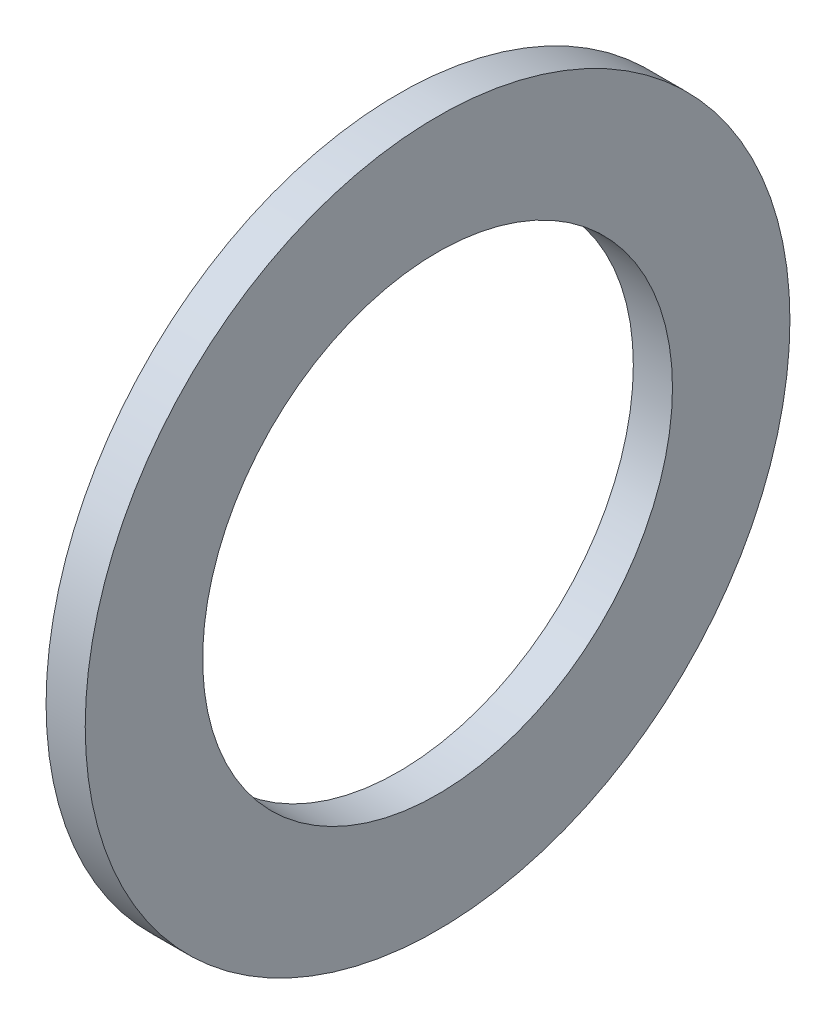
ISO-10303-21;
HEADER;
FILE_DESCRIPTION(('STEP AP214'),'2;1');
FILE_NAME('part.step','',(''),(''),'','','');
FILE_SCHEMA(('AUTOMOTIVE_DESIGN { 1 0 10303 214 1 1 1 1 }'));
ENDSEC;
DATA;
#1=APPLICATION_CONTEXT('core data for automotive mechanical design processes');
#2=APPLICATION_PROTOCOL_DEFINITION('international standard','automotive_design',2000,#1);
#3=PRODUCT_CONTEXT('',#1,'mechanical');
#4=PRODUCT('Part','Part','',(#3));
#5=PRODUCT_RELATED_PRODUCT_CATEGORY('part','',(#4));
#6=PRODUCT_DEFINITION_FORMATION('','',#4);
#7=PRODUCT_DEFINITION_CONTEXT('part definition',#1,'design');
#8=PRODUCT_DEFINITION('design','',#6,#7);
#9=PRODUCT_DEFINITION_SHAPE('','',#8);
#10=(LENGTH_UNIT() NAMED_UNIT(*) SI_UNIT(.MILLI.,.METRE.));
#11=(NAMED_UNIT(*) PLANE_ANGLE_UNIT() SI_UNIT($,.RADIAN.));
#12=(NAMED_UNIT(*) SI_UNIT($,.STERADIAN.) SOLID_ANGLE_UNIT());
#13=UNCERTAINTY_MEASURE_WITH_UNIT(LENGTH_MEASURE(1.E-05),#10,'distance_accuracy_value','');
#14=(GEOMETRIC_REPRESENTATION_CONTEXT(3) GLOBAL_UNCERTAINTY_ASSIGNED_CONTEXT((#13)) GLOBAL_UNIT_ASSIGNED_CONTEXT((#10,
#11,#12)) REPRESENTATION_CONTEXT('',''));
#15=CARTESIAN_POINT('',(0.,0.,0.));
#16=DIRECTION('',(0.,0.,1.));
#17=DIRECTION('',(1.,0.,0.));
#18=AXIS2_PLACEMENT_3D('',#15,#16,#17);
#19=CARTESIAN_POINT('',(1.,0.,0.));
#20=DIRECTION('',(1.,0.,0.));
#21=DIRECTION('',(0.,0.,-1.));
#22=AXIS2_PLACEMENT_3D('',#19,#20,#21);
#23=PLANE('',#22);
#24=CARTESIAN_POINT('',(1.,0.,0.));
#25=DIRECTION('',(1.,0.,0.));
#26=DIRECTION('',(0.,0.,-1.));
#27=AXIS2_PLACEMENT_3D('',#24,#25,#26);
#28=CIRCLE('',#27,9.);
#29=CARTESIAN_POINT('',(1.,0.,-9.));
#30=VERTEX_POINT('',#29);
#31=EDGE_CURVE('E27',#30,#30,#28,.F.);
#32=ORIENTED_EDGE('',*,*,#31,.F.);
#33=EDGE_LOOP('',(#32));
#34=FACE_BOUND('',#33,.T.);
#35=CARTESIAN_POINT('',(1.,0.,0.));
#36=DIRECTION('',(1.,0.,0.));
#37=DIRECTION('',(0.,0.,-1.));
#38=AXIS2_PLACEMENT_3D('',#35,#36,#37);
#39=CIRCLE('',#38,6.);
#40=CARTESIAN_POINT('',(1.,0.,-6.));
#41=VERTEX_POINT('',#40);
#42=EDGE_CURVE('E18',#41,#41,#39,.F.);
#43=ORIENTED_EDGE('',*,*,#42,.T.);
#44=EDGE_LOOP('',(#43));
#45=FACE_BOUND('',#44,.T.);
#46=ADVANCED_FACE('F15',(#34,#45),#23,.T.);
#47=CARTESIAN_POINT('',(-0.05,0.,0.));
#48=DIRECTION('',(1.,0.,0.));
#49=DIRECTION('',(0.,0.,-1.));
#50=AXIS2_PLACEMENT_3D('',#47,#48,#49);
#51=CYLINDRICAL_SURFACE('',#50,6.);
#52=ORIENTED_EDGE('',*,*,#42,.F.);
#53=EDGE_LOOP('',(#52));
#54=FACE_BOUND('',#53,.T.);
#55=CARTESIAN_POINT('',(0.,0.,0.));
#56=DIRECTION('',(1.,0.,0.));
#57=DIRECTION('',(0.,0.,-1.));
#58=AXIS2_PLACEMENT_3D('',#55,#56,#57);
#59=CIRCLE('',#58,6.);
#60=CARTESIAN_POINT('',(0.,0.,-6.));
#61=VERTEX_POINT('',#60);
#62=EDGE_CURVE('E22',#61,#61,#59,.F.);
#63=ORIENTED_EDGE('',*,*,#62,.T.);
#64=EDGE_LOOP('',(#63));
#65=FACE_BOUND('',#64,.T.);
#66=ADVANCED_FACE('F36',(#54,#65),#51,.F.);
#67=CARTESIAN_POINT('',(-0.05,0.,0.));
#68=DIRECTION('',(1.,0.,0.));
#69=DIRECTION('',(0.,0.,-1.));
#70=AXIS2_PLACEMENT_3D('',#67,#68,#69);
#71=CYLINDRICAL_SURFACE('',#70,9.);
#72=ORIENTED_EDGE('',*,*,#31,.T.);
#73=EDGE_LOOP('',(#72));
#74=FACE_BOUND('',#73,.T.);
#75=CARTESIAN_POINT('',(0.,0.,0.));
#76=DIRECTION('',(1.,0.,0.));
#77=DIRECTION('',(0.,0.,-1.));
#78=AXIS2_PLACEMENT_3D('',#75,#76,#77);
#79=CIRCLE('',#78,9.);
#80=CARTESIAN_POINT('',(0.,0.,-9.));
#81=VERTEX_POINT('',#80);
#82=EDGE_CURVE('E10',#81,#81,#79,.T.);
#83=ORIENTED_EDGE('',*,*,#82,.T.);
#84=EDGE_LOOP('',(#83));
#85=FACE_BOUND('',#84,.T.);
#86=ADVANCED_FACE('F39',(#74,#85),#71,.T.);
#87=CARTESIAN_POINT('',(0.,0.,0.));
#88=DIRECTION('',(1.,0.,0.));
#89=DIRECTION('',(0.,0.,-1.));
#90=AXIS2_PLACEMENT_3D('',#87,#88,#89);
#91=PLANE('',#90);
#92=ORIENTED_EDGE('',*,*,#82,.F.);
#93=EDGE_LOOP('',(#92));
#94=FACE_BOUND('',#93,.T.);
#95=ORIENTED_EDGE('',*,*,#62,.F.);
#96=EDGE_LOOP('',(#95));
#97=FACE_BOUND('',#96,.T.);
#98=ADVANCED_FACE('F42',(#94,#97),#91,.F.);
#99=CLOSED_SHELL('',(#46,#66,#86,#98));
#100=MANIFOLD_SOLID_BREP('B1',#99);
#101=ADVANCED_BREP_SHAPE_REPRESENTATION('',(#18,#100),#14);
#102=SHAPE_DEFINITION_REPRESENTATION(#9,#101);
ENDSEC;
END-ISO-10303-21;
